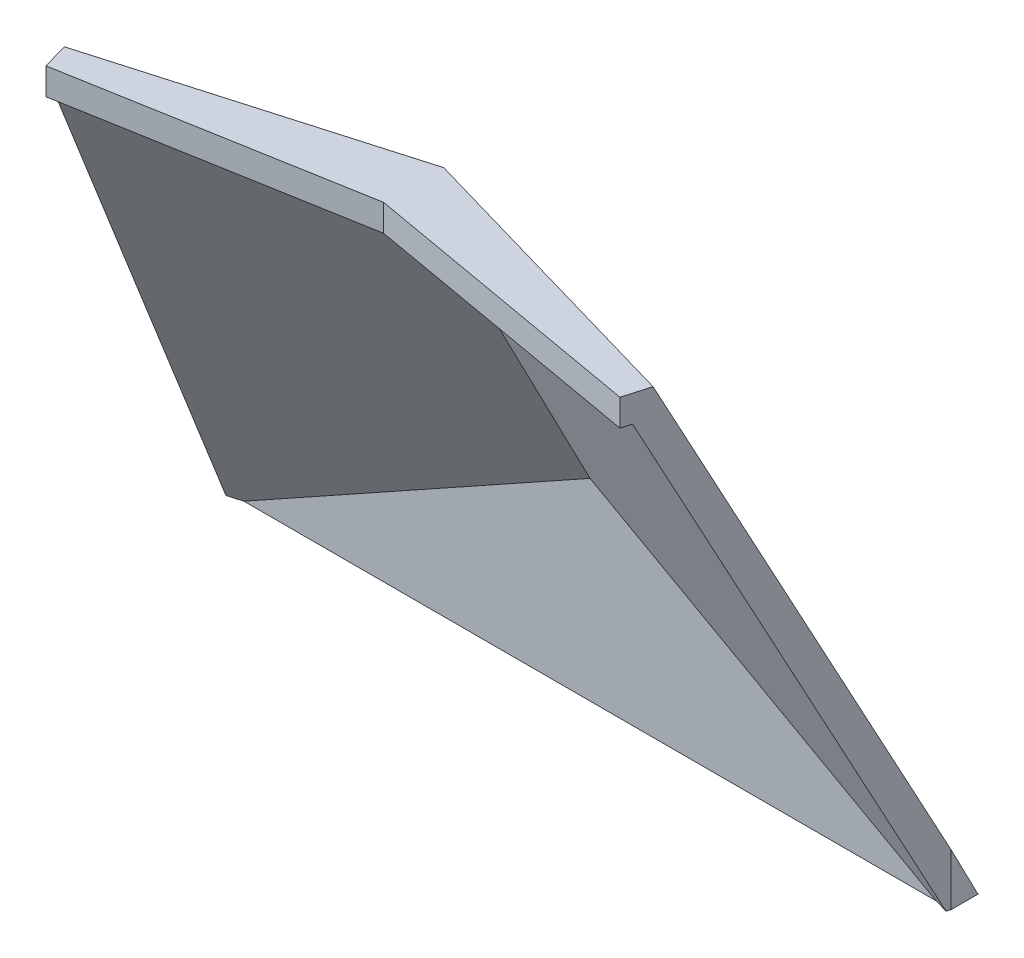
ISO-10303-21;
HEADER;
FILE_DESCRIPTION(('STEP AP214'),'2;1');
FILE_NAME('part.step','',(''),(''),'','','');
FILE_SCHEMA(('AUTOMOTIVE_DESIGN { 1 0 10303 214 1 1 1 1 }'));
ENDSEC;
DATA;
#1=APPLICATION_CONTEXT('core data for automotive mechanical design processes');
#2=APPLICATION_PROTOCOL_DEFINITION('international standard','automotive_design',2000,#1);
#3=PRODUCT_CONTEXT('',#1,'mechanical');
#4=PRODUCT('Part','Part','',(#3));
#5=PRODUCT_RELATED_PRODUCT_CATEGORY('part','',(#4));
#6=PRODUCT_DEFINITION_FORMATION('','',#4);
#7=PRODUCT_DEFINITION_CONTEXT('part definition',#1,'design');
#8=PRODUCT_DEFINITION('design','',#6,#7);
#9=PRODUCT_DEFINITION_SHAPE('','',#8);
#10=(LENGTH_UNIT() NAMED_UNIT(*) SI_UNIT(.MILLI.,.METRE.));
#11=(NAMED_UNIT(*) PLANE_ANGLE_UNIT() SI_UNIT($,.RADIAN.));
#12=(NAMED_UNIT(*) SI_UNIT($,.STERADIAN.) SOLID_ANGLE_UNIT());
#13=UNCERTAINTY_MEASURE_WITH_UNIT(LENGTH_MEASURE(1.E-05),#10,'distance_accuracy_value','');
#14=(GEOMETRIC_REPRESENTATION_CONTEXT(3) GLOBAL_UNCERTAINTY_ASSIGNED_CONTEXT((#13)) GLOBAL_UNIT_ASSIGNED_CONTEXT((#10,
#11,#12)) REPRESENTATION_CONTEXT('',''));
#15=CARTESIAN_POINT('',(0.,0.,0.));
#16=DIRECTION('',(0.,0.,1.));
#17=DIRECTION('',(1.,0.,0.));
#18=AXIS2_PLACEMENT_3D('',#15,#16,#17);
#19=CARTESIAN_POINT('',(-27.,40.,0.));
#20=DIRECTION('',(1.,0.,0.));
#21=DIRECTION('',(0.,0.,-1.));
#22=AXIS2_PLACEMENT_3D('',#19,#20,#21);
#23=PLANE('',#22);
#24=DIRECTION('',(0.,-1.,0.));
#25=VECTOR('',#24,1.);
#26=CARTESIAN_POINT('',(-27.,40.,2.));
#27=LINE('',#26,#25);
#28=CARTESIAN_POINT('',(-27.,3.85809128223332,2.));
#29=VERTEX_POINT('',#28);
#30=CARTESIAN_POINT('',(-27.,0.,2.));
#31=VERTEX_POINT('',#30);
#32=EDGE_CURVE('E262',#29,#31,#27,.T.);
#33=ORIENTED_EDGE('',*,*,#32,.F.);
#34=DIRECTION('',(0.,-0.88780077150143,-0.460227976248147));
#35=VECTOR('',#34,1.);
#36=CARTESIAN_POINT('',(-27.,31.5276083951414,16.3436300951859));
#37=LINE('',#36,#35);
#38=CARTESIAN_POINT('',(-27.,0.,0.));
#39=VERTEX_POINT('',#38);
#40=EDGE_CURVE('E200',#29,#39,#37,.T.);
#41=ORIENTED_EDGE('',*,*,#40,.T.);
#42=DIRECTION('',(0.,0.,1.));
#43=VECTOR('',#42,1.);
#44=CARTESIAN_POINT('',(-27.,0.,0.));
#45=LINE('',#44,#43);
#46=EDGE_CURVE('E214',#39,#31,#45,.T.);
#47=ORIENTED_EDGE('',*,*,#46,.T.);
#48=EDGE_LOOP('',(#33,#41,#47));
#49=FACE_BOUND('',#48,.T.);
#50=ADVANCED_FACE('F45',(#49),#23,.F.);
#51=CARTESIAN_POINT('',(-27.,40.,2.));
#52=DIRECTION('',(0.960735688069258,0.,-0.277465200827222));
#53=DIRECTION('',(-0.277465200827222,0.,-0.960735688069258));
#54=AXIS2_PLACEMENT_3D('',#51,#52,#53);
#55=PLANE('',#54);
#56=DIRECTION('',(0.123695978191477,0.89512901862663,0.428302865962603));
#57=VECTOR('',#56,1.);
#58=CARTESIAN_POINT('',(-27.036407135425,-0.891614356126069,1.87393866258221));
#59=LINE('',#58,#57);
#60=CARTESIAN_POINT('',(-26.9131968409807,0.,2.30055982681181));
#61=VERTEX_POINT('',#60);
#62=CARTESIAN_POINT('',(-21.6620575376344,38.,20.4828649112229));
#63=VERTEX_POINT('',#62);
#64=EDGE_CURVE('E168',#61,#63,#59,.T.);
#65=ORIENTED_EDGE('',*,*,#64,.T.);
#66=DIRECTION('',(0.277465200827222,0.,0.960735688069258));
#67=VECTOR('',#66,1.);
#68=CARTESIAN_POINT('',(-27.,38.,2.));
#69=LINE('',#68,#67);
#70=CARTESIAN_POINT('',(-21.4506959834556,38.,21.2147137613852));
#71=VERTEX_POINT('',#70);
#72=EDGE_CURVE('E159',#63,#71,#69,.T.);
#73=ORIENTED_EDGE('',*,*,#72,.T.);
#74=DIRECTION('',(0.,-1.,0.));
#75=VECTOR('',#74,1.);
#76=CARTESIAN_POINT('',(-21.4506959834556,40.,21.2147137613852));
#77=LINE('',#76,#75);
#78=CARTESIAN_POINT('',(-21.4506959834556,40.,21.2147137613852));
#79=VERTEX_POINT('',#78);
#80=EDGE_CURVE('E258',#79,#71,#77,.T.);
#81=ORIENTED_EDGE('',*,*,#80,.F.);
#82=DIRECTION('',(0.277465200827222,0.,0.960735688069258));
#83=VECTOR('',#82,1.);
#84=CARTESIAN_POINT('',(-27.,40.,2.));
#85=LINE('',#84,#83);
#86=CARTESIAN_POINT('',(-22.00562638511,40.,19.2932423852466));
#87=VERTEX_POINT('',#86);
#88=EDGE_CURVE('E215',#87,#79,#85,.T.);
#89=ORIENTED_EDGE('',*,*,#88,.F.);
#90=DIRECTION('',(0.123695978191477,0.89512901862663,0.428302865962603));
#91=VECTOR('',#90,1.);
#92=CARTESIAN_POINT('',(-27.533141441264,0.,0.153973875340186));
#93=LINE('',#92,#91);
#94=EDGE_CURVE('E191',#29,#87,#93,.T.);
#95=ORIENTED_EDGE('',*,*,#94,.F.);
#96=ORIENTED_EDGE('',*,*,#32,.T.);
#97=DIRECTION('',(0.277465200827222,0.,0.960735688069258));
#98=VECTOR('',#97,1.);
#99=CARTESIAN_POINT('',(-27.,0.,2.));
#100=LINE('',#99,#98);
#101=EDGE_CURVE('E233',#31,#61,#100,.T.);
#102=ORIENTED_EDGE('',*,*,#101,.T.);
#103=EDGE_LOOP('',(#65,#73,#81,#89,#95,#96,#102));
#104=FACE_BOUND('',#103,.T.);
#105=ADVANCED_FACE('F302',(#104),#55,.F.);
#106=CARTESIAN_POINT('',(-21.4506959834556,40.,21.2147137613852));
#107=DIRECTION('',(-0.173648177666931,0.,-0.984807753012208));
#108=DIRECTION('',(-0.984807753012208,0.,0.173648177666931));
#109=AXIS2_PLACEMENT_3D('',#106,#107,#108);
#110=PLANE('',#109);
#111=ORIENTED_EDGE('',*,*,#80,.T.);
#112=DIRECTION('',(0.984807753012208,0.,-0.173648177666931));
#113=VECTOR('',#112,1.);
#114=CARTESIAN_POINT('',(-21.4506959834556,38.,21.2147137613852));
#115=LINE('',#114,#113);
#116=CARTESIAN_POINT('',(0.,38.,17.4323773045272));
#117=VERTEX_POINT('',#116);
#118=EDGE_CURVE('E177',#71,#117,#115,.T.);
#119=ORIENTED_EDGE('',*,*,#118,.T.);
#120=DIRECTION('',(0.,-1.,0.));
#121=VECTOR('',#120,1.);
#122=CARTESIAN_POINT('',(0.,40.,17.4323773045272));
#123=LINE('',#122,#121);
#124=CARTESIAN_POINT('',(0.,40.,17.4323773045272));
#125=VERTEX_POINT('',#124);
#126=EDGE_CURVE('E254',#125,#117,#123,.T.);
#127=ORIENTED_EDGE('',*,*,#126,.F.);
#128=DIRECTION('',(0.984807753012208,0.,-0.173648177666931));
#129=VECTOR('',#128,1.);
#130=CARTESIAN_POINT('',(-21.4506959834556,40.,21.2147137613852));
#131=LINE('',#130,#129);
#132=EDGE_CURVE('E218',#79,#125,#131,.T.);
#133=ORIENTED_EDGE('',*,*,#132,.F.);
#134=EDGE_LOOP('',(#111,#119,#127,#133));
#135=FACE_BOUND('',#134,.T.);
#136=ADVANCED_FACE('F306',(#135),#110,.F.);
#137=CARTESIAN_POINT('',(0.,40.,17.4323773045272));
#138=DIRECTION('',(0.173648177666968,0.,-0.984807753012201));
#139=DIRECTION('',(-0.984807753012201,0.,-0.173648177666968));
#140=AXIS2_PLACEMENT_3D('',#137,#138,#139);
#141=PLANE('',#140);
#142=ORIENTED_EDGE('',*,*,#126,.T.);
#143=DIRECTION('',(0.984807753012201,0.,0.173648177666968));
#144=VECTOR('',#143,1.);
#145=CARTESIAN_POINT('',(0.,38.,17.4323773045272));
#146=LINE('',#145,#144);
#147=CARTESIAN_POINT('',(21.4506959834554,38.,21.214713761386));
#148=VERTEX_POINT('',#147);
#149=EDGE_CURVE('E173',#117,#148,#146,.T.);
#150=ORIENTED_EDGE('',*,*,#149,.T.);
#151=DIRECTION('',(0.,-1.,0.));
#152=VECTOR('',#151,1.);
#153=CARTESIAN_POINT('',(21.4506959834554,40.,21.214713761386));
#154=LINE('',#153,#152);
#155=CARTESIAN_POINT('',(21.4506959834554,40.,21.214713761386));
#156=VERTEX_POINT('',#155);
#157=EDGE_CURVE('E250',#156,#148,#154,.T.);
#158=ORIENTED_EDGE('',*,*,#157,.F.);
#159=DIRECTION('',(0.984807753012201,0.,0.173648177666968));
#160=VECTOR('',#159,1.);
#161=CARTESIAN_POINT('',(0.,40.,17.4323773045272));
#162=LINE('',#161,#160);
#163=EDGE_CURVE('E222',#125,#156,#162,.T.);
#164=ORIENTED_EDGE('',*,*,#163,.F.);
#165=EDGE_LOOP('',(#142,#150,#158,#164));
#166=FACE_BOUND('',#165,.T.);
#167=ADVANCED_FACE('F282',(#166),#141,.F.);
#168=CARTESIAN_POINT('',(27.,40.,2.));
#169=DIRECTION('',(-0.960735688069259,0.,-0.277465200827218));
#170=DIRECTION('',(-0.277465200827218,0.,0.960735688069259));
#171=AXIS2_PLACEMENT_3D('',#168,#169,#170);
#172=PLANE('',#171);
#173=DIRECTION('',(0.277465200827218,0.,-0.960735688069259));
#174=VECTOR('',#173,1.);
#175=CARTESIAN_POINT('',(27.,38.,2.));
#176=LINE('',#175,#174);
#177=CARTESIAN_POINT('',(21.6620575376343,38.,20.4828649112237));
#178=VERTEX_POINT('',#177);
#179=EDGE_CURVE('E166',#148,#178,#176,.T.);
#180=ORIENTED_EDGE('',*,*,#179,.T.);
#181=DIRECTION('',(0.123695978191479,-0.895129018626623,-0.428302865962618));
#182=VECTOR('',#181,1.);
#183=CARTESIAN_POINT('',(27.036407135425,-0.8916143561261,1.87393866258219));
#184=LINE('',#183,#182);
#185=CARTESIAN_POINT('',(26.9131968409808,0.,2.30055982681183));
#186=VERTEX_POINT('',#185);
#187=EDGE_CURVE('E151',#178,#186,#184,.T.);
#188=ORIENTED_EDGE('',*,*,#187,.T.);
#189=DIRECTION('',(0.277465200827218,0.,-0.960735688069259));
#190=VECTOR('',#189,1.);
#191=CARTESIAN_POINT('',(27.,0.,2.));
#192=LINE('',#191,#190);
#193=CARTESIAN_POINT('',(27.,0.,2.));
#194=VERTEX_POINT('',#193);
#195=EDGE_CURVE('E237',#186,#194,#192,.T.);
#196=ORIENTED_EDGE('',*,*,#195,.T.);
#197=DIRECTION('',(0.,-1.,0.));
#198=VECTOR('',#197,1.);
#199=CARTESIAN_POINT('',(27.,40.,2.));
#200=LINE('',#199,#198);
#201=CARTESIAN_POINT('',(27.,3.85809128223327,2.00000000000006));
#202=VERTEX_POINT('',#201);
#203=EDGE_CURVE('E229',#202,#194,#200,.T.);
#204=ORIENTED_EDGE('',*,*,#203,.F.);
#205=DIRECTION('',(0.123695978191479,-0.895129018626623,-0.428302865962618));
#206=VECTOR('',#205,1.);
#207=CARTESIAN_POINT('',(27.533141441264,0.,0.153973875340182));
#208=LINE('',#207,#206);
#209=CARTESIAN_POINT('',(22.0056263851099,40.,19.2932423852474));
#210=VERTEX_POINT('',#209);
#211=EDGE_CURVE('E204',#210,#202,#208,.T.);
#212=ORIENTED_EDGE('',*,*,#211,.F.);
#213=DIRECTION('',(0.277465200827218,0.,-0.960735688069259));
#214=VECTOR('',#213,1.);
#215=CARTESIAN_POINT('',(27.,40.,2.));
#216=LINE('',#215,#214);
#217=EDGE_CURVE('E225',#156,#210,#216,.T.);
#218=ORIENTED_EDGE('',*,*,#217,.F.);
#219=ORIENTED_EDGE('',*,*,#157,.T.);
#220=EDGE_LOOP('',(#180,#188,#196,#204,#212,#218,#219));
#221=FACE_BOUND('',#220,.T.);
#222=ADVANCED_FACE('F275',(#221),#172,.F.);
#223=CARTESIAN_POINT('',(27.,40.,0.));
#224=DIRECTION('',(-1.,0.,0.));
#225=DIRECTION('',(0.,0.,1.));
#226=AXIS2_PLACEMENT_3D('',#223,#224,#225);
#227=PLANE('',#226);
#228=DIRECTION('',(0.,0.,-1.));
#229=VECTOR('',#228,1.);
#230=CARTESIAN_POINT('',(27.,0.,0.));
#231=LINE('',#230,#229);
#232=CARTESIAN_POINT('',(27.,0.,0.));
#233=VERTEX_POINT('',#232);
#234=EDGE_CURVE('E240',#194,#233,#231,.T.);
#235=ORIENTED_EDGE('',*,*,#234,.T.);
#236=DIRECTION('',(0.,0.887800771501423,0.460227976248162));
#237=VECTOR('',#236,1.);
#238=CARTESIAN_POINT('',(27.,31.5276083951408,16.3436300951863));
#239=LINE('',#238,#237);
#240=EDGE_CURVE('E210',#233,#202,#239,.T.);
#241=ORIENTED_EDGE('',*,*,#240,.T.);
#242=ORIENTED_EDGE('',*,*,#203,.T.);
#243=EDGE_LOOP('',(#235,#241,#242));
#244=FACE_BOUND('',#243,.T.);
#245=ADVANCED_FACE('F292',(#244),#227,.F.);
#246=CARTESIAN_POINT('',(-27.,40.,0.));
#247=DIRECTION('',(0.,0.,1.));
#248=DIRECTION('',(1.,0.,0.));
#249=AXIS2_PLACEMENT_3D('',#246,#247,#248);
#250=PLANE('',#249);
#251=DIRECTION('',(-1.,0.,0.));
#252=VECTOR('',#251,1.);
#253=CARTESIAN_POINT('',(-27.,0.,0.));
#254=LINE('',#253,#252);
#255=EDGE_CURVE('E219',#233,#39,#254,.T.);
#256=ORIENTED_EDGE('',*,*,#255,.T.);
#257=DIRECTION('',(0.87357725056071,0.486685511704212,0.));
#258=VECTOR('',#257,1.);
#259=CARTESIAN_POINT('',(-9.99370435190809,9.47451149211163,0.));
#260=LINE('',#259,#258);
#261=CARTESIAN_POINT('',(-7.55862958408101E-13,15.042182940981,0.));
#262=VERTEX_POINT('',#261);
#263=EDGE_CURVE('E196',#39,#262,#260,.T.);
#264=ORIENTED_EDGE('',*,*,#263,.T.);
#265=DIRECTION('',(0.873577250560722,-0.486685511704191,0.));
#266=VECTOR('',#265,1.);
#267=CARTESIAN_POINT('',(-31.2157051337418,32.4330106170342,0.));
#268=LINE('',#267,#266);
#269=EDGE_CURVE('E207',#262,#233,#268,.T.);
#270=ORIENTED_EDGE('',*,*,#269,.T.);
#271=EDGE_LOOP('',(#256,#264,#270));
#272=FACE_BOUND('',#271,.T.);
#273=ADVANCED_FACE('F294',(#272),#250,.F.);
#274=CARTESIAN_POINT('',(0.,40.,0.));
#275=DIRECTION('',(0.,1.,0.));
#276=DIRECTION('',(0.,0.,1.));
#277=AXIS2_PLACEMENT_3D('',#274,#275,#276);
#278=PLANE('',#277);
#279=DIRECTION('',(-0.960735688069258,0.,0.277465200827222));
#280=VECTOR('',#279,1.);
#281=CARTESIAN_POINT('',(28.3702204219692,40.,4.7444495957776));
#282=LINE('',#281,#280);
#283=CARTESIAN_POINT('',(-1.65395754928442E-12,40.,12.9379090504942));
#284=VERTEX_POINT('',#283);
#285=EDGE_CURVE('E68',#284,#87,#282,.T.);
#286=ORIENTED_EDGE('',*,*,#285,.T.);
#287=ORIENTED_EDGE('',*,*,#88,.T.);
#288=ORIENTED_EDGE('',*,*,#132,.T.);
#289=ORIENTED_EDGE('',*,*,#163,.T.);
#290=ORIENTED_EDGE('',*,*,#217,.T.);
#291=DIRECTION('',(0.960735688069259,0.,0.277465200827218));
#292=VECTOR('',#291,1.);
#293=CARTESIAN_POINT('',(-3.44886773906179,40.,11.9418590528429));
#294=LINE('',#293,#292);
#295=EDGE_CURVE('E53',#284,#210,#294,.T.);
#296=ORIENTED_EDGE('',*,*,#295,.F.);
#297=EDGE_LOOP('',(#286,#287,#288,#289,#290,#296));
#298=FACE_BOUND('',#297,.T.);
#299=ADVANCED_FACE('F276',(#298),#278,.T.);
#300=CARTESIAN_POINT('',(0.,0.,0.));
#301=DIRECTION('',(0.,1.,0.));
#302=DIRECTION('',(0.,0.,1.));
#303=AXIS2_PLACEMENT_3D('',#300,#301,#302);
#304=PLANE('',#303);
#305=DIRECTION('',(-1.,0.,0.));
#306=VECTOR('',#305,1.);
#307=CARTESIAN_POINT('',(-27.,0.,2.));
#308=LINE('',#307,#306);
#309=CARTESIAN_POINT('',(25.8724949758202,0.,2.));
#310=VERTEX_POINT('',#309);
#311=CARTESIAN_POINT('',(-25.8724949758202,0.,2.));
#312=VERTEX_POINT('',#311);
#313=EDGE_CURVE('E60',#310,#312,#308,.T.);
#314=ORIENTED_EDGE('',*,*,#313,.T.);
#315=DIRECTION('',(-0.960735688069257,0.,0.277465200827222));
#316=VECTOR('',#315,1.);
#317=CARTESIAN_POINT('',(23.4626499660984,0.,-12.2482329626572));
#318=LINE('',#317,#316);
#319=EDGE_CURVE('E149',#312,#61,#318,.T.);
#320=ORIENTED_EDGE('',*,*,#319,.T.);
#321=ORIENTED_EDGE('',*,*,#101,.F.);
#322=ORIENTED_EDGE('',*,*,#46,.F.);
#323=ORIENTED_EDGE('',*,*,#255,.F.);
#324=ORIENTED_EDGE('',*,*,#234,.F.);
#325=ORIENTED_EDGE('',*,*,#195,.F.);
#326=DIRECTION('',(0.960735688069259,0.,0.277465200827218));
#327=VECTOR('',#326,1.);
#328=CARTESIAN_POINT('',(1.45870271680911,0.,-5.05082350559267));
#329=LINE('',#328,#327);
#330=EDGE_CURVE('E144',#310,#186,#329,.T.);
#331=ORIENTED_EDGE('',*,*,#330,.F.);
#332=EDGE_LOOP('',(#314,#320,#321,#322,#323,#324,#325,#331));
#333=FACE_BOUND('',#332,.T.);
#334=ADVANCED_FACE('F288',(#333),#304,.F.);
#335=CARTESIAN_POINT('',(-22.8427053658152,0.,-14.3948189141286));
#336=DIRECTION('',(-0.248367152919506,-0.445807178063049,0.859982393621009));
#337=DIRECTION('',(0.,-0.887800771501423,-0.460227976248162));
#338=AXIS2_PLACEMENT_3D('',#335,#336,#337);
#339=PLANE('',#338);
#340=ORIENTED_EDGE('',*,*,#269,.F.);
#341=DIRECTION('',(0.,0.887800771501426,0.460227976248155));
#342=VECTOR('',#341,1.);
#343=CARTESIAN_POINT('',(-1.17961196366423E-13,-2.69550827879406,-9.19506041832562));
#344=LINE('',#343,#342);
#345=EDGE_CURVE('E11',#262,#284,#344,.T.);
#346=ORIENTED_EDGE('',*,*,#345,.T.);
#347=ORIENTED_EDGE('',*,*,#295,.T.);
#348=ORIENTED_EDGE('',*,*,#211,.T.);
#349=ORIENTED_EDGE('',*,*,#240,.F.);
#350=EDGE_LOOP('',(#340,#346,#347,#348,#349));
#351=FACE_BOUND('',#350,.T.);
#352=ADVANCED_FACE('F269',(#351),#339,.F.);
#353=CARTESIAN_POINT('',(22.8427053658152,0.,-14.3948189141288));
#354=DIRECTION('',(0.248367152919512,-0.445807178063034,0.859982393621015));
#355=DIRECTION('',(0.,-0.88780077150143,-0.460227976248147));
#356=AXIS2_PLACEMENT_3D('',#353,#354,#355);
#357=PLANE('',#356);
#358=ORIENTED_EDGE('',*,*,#94,.T.);
#359=ORIENTED_EDGE('',*,*,#285,.F.);
#360=ORIENTED_EDGE('',*,*,#345,.F.);
#361=ORIENTED_EDGE('',*,*,#263,.F.);
#362=ORIENTED_EDGE('',*,*,#40,.F.);
#363=EDGE_LOOP('',(#358,#359,#360,#361,#362));
#364=FACE_BOUND('',#363,.T.);
#365=ADVANCED_FACE('F296',(#364),#357,.F.);
#366=CARTESIAN_POINT('',(-27.,40.,2.));
#367=DIRECTION('',(0.,0.,1.));
#368=DIRECTION('',(1.,0.,0.));
#369=AXIS2_PLACEMENT_3D('',#366,#367,#368);
#370=PLANE('',#369);
#371=ORIENTED_EDGE('',*,*,#313,.F.);
#372=DIRECTION('',(0.873577250560722,-0.486685511704191,0.));
#373=VECTOR('',#372,1.);
#374=CARTESIAN_POINT('',(-31.4827691164669,31.9536435223864,2.));
#375=LINE('',#374,#373);
#376=CARTESIAN_POINT('',(-7.61738126651311E-13,14.4140297246629,2.));
#377=VERTEX_POINT('',#376);
#378=EDGE_CURVE('E138',#377,#310,#375,.T.);
#379=ORIENTED_EDGE('',*,*,#378,.F.);
#380=DIRECTION('',(0.87357725056071,0.486685511704212,0.));
#381=VECTOR('',#380,1.);
#382=CARTESIAN_POINT('',(-9.72664036918297,8.99514439746388,2.));
#383=LINE('',#382,#381);
#384=EDGE_CURVE('E146',#312,#377,#383,.T.);
#385=ORIENTED_EDGE('',*,*,#384,.F.);
#386=EDGE_LOOP('',(#371,#379,#385));
#387=FACE_BOUND('',#386,.T.);
#388=ADVANCED_FACE('F154',(#387),#370,.T.);
#389=CARTESIAN_POINT('',(0.,38.,0.));
#390=DIRECTION('',(0.,1.,0.));
#391=DIRECTION('',(0.,0.,1.));
#392=AXIS2_PLACEMENT_3D('',#389,#390,#391);
#393=PLANE('',#392);
#394=DIRECTION('',(-0.960735688069257,0.,0.277465200827222));
#395=VECTOR('',#394,1.);
#396=CARTESIAN_POINT('',(28.7137892694447,38.,5.93407212175391));
#397=LINE('',#396,#395);
#398=CARTESIAN_POINT('',(-1.61039279127163E-12,38.,14.2267559525883));
#399=VERTEX_POINT('',#398);
#400=EDGE_CURVE('E152',#399,#63,#397,.T.);
#401=ORIENTED_EDGE('',*,*,#400,.F.);
#402=DIRECTION('',(0.960735688069259,0.,0.277465200827218));
#403=VECTOR('',#402,1.);
#404=CARTESIAN_POINT('',(-3.79243658653734,38.,13.1314815788192));
#405=LINE('',#404,#403);
#406=EDGE_CURVE('E141',#399,#178,#405,.T.);
#407=ORIENTED_EDGE('',*,*,#406,.T.);
#408=ORIENTED_EDGE('',*,*,#179,.F.);
#409=ORIENTED_EDGE('',*,*,#149,.F.);
#410=ORIENTED_EDGE('',*,*,#118,.F.);
#411=ORIENTED_EDGE('',*,*,#72,.F.);
#412=EDGE_LOOP('',(#401,#407,#408,#409,#410,#411));
#413=FACE_BOUND('',#412,.T.);
#414=ADVANCED_FACE('F285',(#413),#393,.F.);
#415=CARTESIAN_POINT('',(-23.3394396716543,-0.891614356126098,-12.6748541268866));
#416=DIRECTION('',(-0.248367152919506,-0.445807178063049,0.859982393621009));
#417=DIRECTION('',(0.,-0.887800771501423,-0.460227976248162));
#418=AXIS2_PLACEMENT_3D('',#415,#416,#417);
#419=PLANE('',#418);
#420=ORIENTED_EDGE('',*,*,#378,.T.);
#421=ORIENTED_EDGE('',*,*,#330,.T.);
#422=ORIENTED_EDGE('',*,*,#187,.F.);
#423=ORIENTED_EDGE('',*,*,#406,.F.);
#424=DIRECTION('',(0.,0.887800771501426,0.460227976248155));
#425=VECTOR('',#424,1.);
#426=CARTESIAN_POINT('',(-1.14491749414469E-13,-3.64573878446582,-7.36202240330347));
#427=LINE('',#426,#425);
#428=EDGE_CURVE('E135',#377,#399,#427,.T.);
#429=ORIENTED_EDGE('',*,*,#428,.F.);
#430=EDGE_LOOP('',(#420,#421,#422,#423,#429));
#431=FACE_BOUND('',#430,.T.);
#432=ADVANCED_FACE('F137',(#431),#419,.T.);
#433=CARTESIAN_POINT('',(23.3394396716542,-0.891614356126069,-12.6748541268868));
#434=DIRECTION('',(0.248367152919512,-0.445807178063034,0.859982393621015));
#435=DIRECTION('',(0.,-0.88780077150143,-0.460227976248147));
#436=AXIS2_PLACEMENT_3D('',#433,#434,#435);
#437=PLANE('',#436);
#438=ORIENTED_EDGE('',*,*,#64,.F.);
#439=ORIENTED_EDGE('',*,*,#319,.F.);
#440=ORIENTED_EDGE('',*,*,#384,.T.);
#441=ORIENTED_EDGE('',*,*,#428,.T.);
#442=ORIENTED_EDGE('',*,*,#400,.T.);
#443=EDGE_LOOP('',(#438,#439,#440,#441,#442));
#444=FACE_BOUND('',#443,.T.);
#445=ADVANCED_FACE('F147',(#444),#437,.T.);
#446=CLOSED_SHELL('',(#50,#105,#136,#167,#222,#245,#273,#299,#334,#352,#365,#388,#414,#432,#445));
#447=MANIFOLD_SOLID_BREP('B2',#446);
#448=ADVANCED_BREP_SHAPE_REPRESENTATION('',(#18,#447),#14);
#449=SHAPE_DEFINITION_REPRESENTATION(#9,#448);
ENDSEC;
END-ISO-10303-21;
